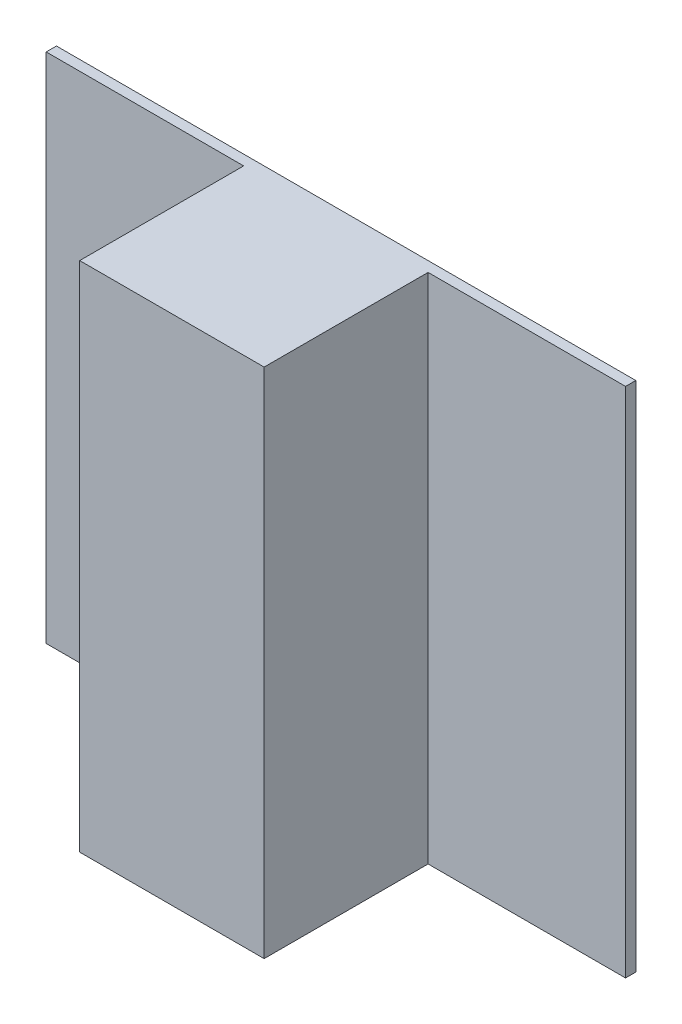
ISO-10303-21;
HEADER;
FILE_DESCRIPTION(('STEP AP214'),'2;1');
FILE_NAME('part.step','',(''),(''),'','','');
FILE_SCHEMA(('AUTOMOTIVE_DESIGN { 1 0 10303 214 1 1 1 1 }'));
ENDSEC;
DATA;
#1=APPLICATION_CONTEXT('core data for automotive mechanical design processes');
#2=APPLICATION_PROTOCOL_DEFINITION('international standard','automotive_design',2000,#1);
#3=PRODUCT_CONTEXT('',#1,'mechanical');
#4=PRODUCT('Part','Part','',(#3));
#5=PRODUCT_RELATED_PRODUCT_CATEGORY('part','',(#4));
#6=PRODUCT_DEFINITION_FORMATION('','',#4);
#7=PRODUCT_DEFINITION_CONTEXT('part definition',#1,'design');
#8=PRODUCT_DEFINITION('design','',#6,#7);
#9=PRODUCT_DEFINITION_SHAPE('','',#8);
#10=(LENGTH_UNIT() NAMED_UNIT(*) SI_UNIT(.MILLI.,.METRE.));
#11=(NAMED_UNIT(*) PLANE_ANGLE_UNIT() SI_UNIT($,.RADIAN.));
#12=(NAMED_UNIT(*) SI_UNIT($,.STERADIAN.) SOLID_ANGLE_UNIT());
#13=UNCERTAINTY_MEASURE_WITH_UNIT(LENGTH_MEASURE(1.E-05),#10,'distance_accuracy_value','');
#14=(GEOMETRIC_REPRESENTATION_CONTEXT(3) GLOBAL_UNCERTAINTY_ASSIGNED_CONTEXT((#13)) GLOBAL_UNIT_ASSIGNED_CONTEXT((#10,
#11,#12)) REPRESENTATION_CONTEXT('',''));
#15=CARTESIAN_POINT('',(0.,0.,0.));
#16=DIRECTION('',(0.,0.,1.));
#17=DIRECTION('',(1.,0.,0.));
#18=AXIS2_PLACEMENT_3D('',#15,#16,#17);
#19=CARTESIAN_POINT('',(0.,0.,5.));
#20=DIRECTION('',(-1.,0.,0.));
#21=DIRECTION('',(0.,0.,1.));
#22=AXIS2_PLACEMENT_3D('',#19,#20,#21);
#23=PLANE('',#22);
#24=DIRECTION('',(0.,0.,-1.));
#25=VECTOR('',#24,1.);
#26=CARTESIAN_POINT('',(0.,0.,5.));
#27=LINE('',#26,#25);
#28=CARTESIAN_POINT('',(0.,0.,5.));
#29=VERTEX_POINT('',#28);
#30=CARTESIAN_POINT('',(0.,0.,-75.));
#31=VERTEX_POINT('',#30);
#32=EDGE_CURVE('E218',#29,#31,#27,.T.);
#33=ORIENTED_EDGE('',*,*,#32,.T.);
#34=DIRECTION('',(0.,-1.,0.));
#35=VECTOR('',#34,1.);
#36=CARTESIAN_POINT('',(0.,250.,-75.));
#37=LINE('',#36,#35);
#38=CARTESIAN_POINT('',(0.,250.,-75.));
#39=VERTEX_POINT('',#38);
#40=EDGE_CURVE('E208',#39,#31,#37,.T.);
#41=ORIENTED_EDGE('',*,*,#40,.F.);
#42=DIRECTION('',(0.,0.,-1.));
#43=VECTOR('',#42,1.);
#44=CARTESIAN_POINT('',(0.,250.,5.));
#45=LINE('',#44,#43);
#46=CARTESIAN_POINT('',(0.,250.,5.));
#47=VERTEX_POINT('',#46);
#48=EDGE_CURVE('E11',#47,#39,#45,.T.);
#49=ORIENTED_EDGE('',*,*,#48,.F.);
#50=DIRECTION('',(0.,1.,0.));
#51=VECTOR('',#50,1.);
#52=CARTESIAN_POINT('',(0.,0.,5.));
#53=LINE('',#52,#51);
#54=EDGE_CURVE('E229',#29,#47,#53,.T.);
#55=ORIENTED_EDGE('',*,*,#54,.F.);
#56=EDGE_LOOP('',(#33,#41,#49,#55));
#57=FACE_BOUND('',#56,.T.);
#58=ADVANCED_FACE('F33',(#57),#23,.F.);
#59=CARTESIAN_POINT('',(0.,250.,5.));
#60=DIRECTION('',(0.,-1.,0.));
#61=DIRECTION('',(0.,0.,-1.));
#62=AXIS2_PLACEMENT_3D('',#59,#60,#61);
#63=PLANE('',#62);
#64=ORIENTED_EDGE('',*,*,#48,.T.);
#65=DIRECTION('',(1.,0.,0.));
#66=VECTOR('',#65,1.);
#67=CARTESIAN_POINT('',(-6.02546336393559,250.,-75.));
#68=LINE('',#67,#66);
#69=CARTESIAN_POINT('',(96.3476528667937,250.,-75.));
#70=VERTEX_POINT('',#69);
#71=EDGE_CURVE('E161',#39,#70,#68,.T.);
#72=ORIENTED_EDGE('',*,*,#71,.T.);
#73=DIRECTION('',(0.,0.,1.));
#74=VECTOR('',#73,1.);
#75=CARTESIAN_POINT('',(96.3476528667937,250.,-80.));
#76=LINE('',#75,#74);
#77=CARTESIAN_POINT('',(96.3476528667937,250.,-80.));
#78=VERTEX_POINT('',#77);
#79=EDGE_CURVE('E179',#78,#70,#76,.T.);
#80=ORIENTED_EDGE('',*,*,#79,.F.);
#81=DIRECTION('',(1.,0.,0.));
#82=VECTOR('',#81,1.);
#83=CARTESIAN_POINT('',(-45.,250.,-80.));
#84=LINE('',#83,#82);
#85=CARTESIAN_POINT('',(-186.347652866794,250.,-80.));
#86=VERTEX_POINT('',#85);
#87=EDGE_CURVE('E162',#86,#78,#84,.T.);
#88=ORIENTED_EDGE('',*,*,#87,.F.);
#89=DIRECTION('',(0.,0.,1.));
#90=VECTOR('',#89,1.);
#91=CARTESIAN_POINT('',(-186.347652866794,250.,-80.));
#92=LINE('',#91,#90);
#93=CARTESIAN_POINT('',(-186.347652866794,250.,-75.));
#94=VERTEX_POINT('',#93);
#95=EDGE_CURVE('E148',#86,#94,#92,.T.);
#96=ORIENTED_EDGE('',*,*,#95,.T.);
#97=DIRECTION('',(-1.,0.,0.));
#98=VECTOR('',#97,1.);
#99=CARTESIAN_POINT('',(-83.9745366360644,250.,-75.));
#100=LINE('',#99,#98);
#101=CARTESIAN_POINT('',(-90.,250.,-75.));
#102=VERTEX_POINT('',#101);
#103=EDGE_CURVE('E145',#102,#94,#100,.T.);
#104=ORIENTED_EDGE('',*,*,#103,.F.);
#105=DIRECTION('',(0.,0.,-1.));
#106=VECTOR('',#105,1.);
#107=CARTESIAN_POINT('',(-90.,250.,5.));
#108=LINE('',#107,#106);
#109=CARTESIAN_POINT('',(-90.,250.,5.));
#110=VERTEX_POINT('',#109);
#111=EDGE_CURVE('E41',#110,#102,#108,.T.);
#112=ORIENTED_EDGE('',*,*,#111,.F.);
#113=DIRECTION('',(-1.,0.,0.));
#114=VECTOR('',#113,1.);
#115=CARTESIAN_POINT('',(0.,250.,5.));
#116=LINE('',#115,#114);
#117=EDGE_CURVE('E228',#47,#110,#116,.T.);
#118=ORIENTED_EDGE('',*,*,#117,.F.);
#119=EDGE_LOOP('',(#64,#72,#80,#88,#96,#104,#112,#118));
#120=FACE_BOUND('',#119,.T.);
#121=ADVANCED_FACE('F241',(#120),#63,.F.);
#122=CARTESIAN_POINT('',(-90.,0.,5.));
#123=DIRECTION('',(1.,0.,0.));
#124=DIRECTION('',(0.,0.,-1.));
#125=AXIS2_PLACEMENT_3D('',#122,#123,#124);
#126=PLANE('',#125);
#127=ORIENTED_EDGE('',*,*,#111,.T.);
#128=DIRECTION('',(0.,1.,0.));
#129=VECTOR('',#128,1.);
#130=CARTESIAN_POINT('',(-90.,250.,-75.));
#131=LINE('',#130,#129);
#132=CARTESIAN_POINT('',(-90.,0.,-75.));
#133=VERTEX_POINT('',#132);
#134=EDGE_CURVE('E211',#133,#102,#131,.T.);
#135=ORIENTED_EDGE('',*,*,#134,.F.);
#136=DIRECTION('',(0.,0.,-1.));
#137=VECTOR('',#136,1.);
#138=CARTESIAN_POINT('',(-90.,0.,5.));
#139=LINE('',#138,#137);
#140=CARTESIAN_POINT('',(-90.,0.,5.));
#141=VERTEX_POINT('',#140);
#142=EDGE_CURVE('E220',#141,#133,#139,.T.);
#143=ORIENTED_EDGE('',*,*,#142,.F.);
#144=DIRECTION('',(0.,-1.,0.));
#145=VECTOR('',#144,1.);
#146=CARTESIAN_POINT('',(-90.,0.,5.));
#147=LINE('',#146,#145);
#148=EDGE_CURVE('E226',#110,#141,#147,.T.);
#149=ORIENTED_EDGE('',*,*,#148,.F.);
#150=EDGE_LOOP('',(#127,#135,#143,#149));
#151=FACE_BOUND('',#150,.T.);
#152=ADVANCED_FACE('F245',(#151),#126,.F.);
#153=CARTESIAN_POINT('',(0.,0.,5.));
#154=DIRECTION('',(0.,1.,0.));
#155=DIRECTION('',(-1.,0.,0.));
#156=AXIS2_PLACEMENT_3D('',#153,#154,#155);
#157=PLANE('',#156);
#158=ORIENTED_EDGE('',*,*,#142,.T.);
#159=DIRECTION('',(1.,0.,0.));
#160=VECTOR('',#159,1.);
#161=CARTESIAN_POINT('',(-121.347652866794,0.,-75.));
#162=LINE('',#161,#160);
#163=CARTESIAN_POINT('',(-186.347652866794,0.,-75.));
#164=VERTEX_POINT('',#163);
#165=EDGE_CURVE('E153',#164,#133,#162,.T.);
#166=ORIENTED_EDGE('',*,*,#165,.F.);
#167=DIRECTION('',(0.,0.,1.));
#168=VECTOR('',#167,1.);
#169=CARTESIAN_POINT('',(-186.347652866794,0.,-80.));
#170=LINE('',#169,#168);
#171=CARTESIAN_POINT('',(-186.347652866794,0.,-80.));
#172=VERTEX_POINT('',#171);
#173=EDGE_CURVE('E159',#172,#164,#170,.T.);
#174=ORIENTED_EDGE('',*,*,#173,.F.);
#175=DIRECTION('',(-1.,0.,0.));
#176=VECTOR('',#175,1.);
#177=CARTESIAN_POINT('',(31.3476528667937,0.,-80.));
#178=LINE('',#177,#176);
#179=CARTESIAN_POINT('',(96.3476528667937,0.,-80.));
#180=VERTEX_POINT('',#179);
#181=EDGE_CURVE('E167',#180,#172,#178,.T.);
#182=ORIENTED_EDGE('',*,*,#181,.F.);
#183=DIRECTION('',(0.,0.,1.));
#184=VECTOR('',#183,1.);
#185=CARTESIAN_POINT('',(96.3476528667937,0.,-80.));
#186=LINE('',#185,#184);
#187=CARTESIAN_POINT('',(96.3476528667937,0.,-75.));
#188=VERTEX_POINT('',#187);
#189=EDGE_CURVE('E140',#180,#188,#186,.T.);
#190=ORIENTED_EDGE('',*,*,#189,.T.);
#191=DIRECTION('',(-1.,0.,0.));
#192=VECTOR('',#191,1.);
#193=CARTESIAN_POINT('',(-45.,0.,-75.));
#194=LINE('',#193,#192);
#195=EDGE_CURVE('E165',#188,#31,#194,.T.);
#196=ORIENTED_EDGE('',*,*,#195,.T.);
#197=ORIENTED_EDGE('',*,*,#32,.F.);
#198=DIRECTION('',(1.,0.,0.));
#199=VECTOR('',#198,1.);
#200=CARTESIAN_POINT('',(0.,0.,5.));
#201=LINE('',#200,#199);
#202=EDGE_CURVE('E56',#141,#29,#201,.T.);
#203=ORIENTED_EDGE('',*,*,#202,.F.);
#204=EDGE_LOOP('',(#158,#166,#174,#182,#190,#196,#197,#203));
#205=FACE_BOUND('',#204,.T.);
#206=ADVANCED_FACE('F254',(#205),#157,.F.);
#207=CARTESIAN_POINT('',(0.,0.,5.));
#208=DIRECTION('',(0.,0.,1.));
#209=DIRECTION('',(1.,0.,0.));
#210=AXIS2_PLACEMENT_3D('',#207,#208,#209);
#211=PLANE('',#210);
#212=ORIENTED_EDGE('',*,*,#54,.T.);
#213=ORIENTED_EDGE('',*,*,#117,.T.);
#214=ORIENTED_EDGE('',*,*,#148,.T.);
#215=ORIENTED_EDGE('',*,*,#202,.T.);
#216=EDGE_LOOP('',(#212,#213,#214,#215));
#217=FACE_BOUND('',#216,.T.);
#218=ADVANCED_FACE('F246',(#217),#211,.T.);
#219=CARTESIAN_POINT('',(-5.,245.,-75.));
#220=DIRECTION('',(0.,-1.,0.));
#221=DIRECTION('',(0.,0.,-1.));
#222=AXIS2_PLACEMENT_3D('',#219,#220,#221);
#223=PLANE('',#222);
#224=DIRECTION('',(1.,0.,0.));
#225=VECTOR('',#224,1.);
#226=CARTESIAN_POINT('',(-5.,245.,0.));
#227=LINE('',#226,#225);
#228=CARTESIAN_POINT('',(-85.,245.,0.));
#229=VERTEX_POINT('',#228);
#230=CARTESIAN_POINT('',(-5.,245.,0.));
#231=VERTEX_POINT('',#230);
#232=EDGE_CURVE('E127',#229,#231,#227,.T.);
#233=ORIENTED_EDGE('',*,*,#232,.F.);
#234=DIRECTION('',(0.,0.,1.));
#235=VECTOR('',#234,1.);
#236=CARTESIAN_POINT('',(-85.,245.,-75.));
#237=LINE('',#236,#235);
#238=CARTESIAN_POINT('',(-85.,245.,-80.));
#239=VERTEX_POINT('',#238);
#240=EDGE_CURVE('E48',#239,#229,#237,.T.);
#241=ORIENTED_EDGE('',*,*,#240,.F.);
#242=DIRECTION('',(-1.,0.,0.));
#243=VECTOR('',#242,1.);
#244=CARTESIAN_POINT('',(-45.,245.,-80.));
#245=LINE('',#244,#243);
#246=CARTESIAN_POINT('',(-5.,245.,-80.));
#247=VERTEX_POINT('',#246);
#248=EDGE_CURVE('E125',#247,#239,#245,.T.);
#249=ORIENTED_EDGE('',*,*,#248,.F.);
#250=DIRECTION('',(0.,0.,1.));
#251=VECTOR('',#250,1.);
#252=CARTESIAN_POINT('',(-5.,245.,-75.));
#253=LINE('',#252,#251);
#254=EDGE_CURVE('E206',#247,#231,#253,.T.);
#255=ORIENTED_EDGE('',*,*,#254,.T.);
#256=EDGE_LOOP('',(#233,#241,#249,#255));
#257=FACE_BOUND('',#256,.T.);
#258=ADVANCED_FACE('F123',(#257),#223,.T.);
#259=CARTESIAN_POINT('',(-5.,245.,-75.));
#260=DIRECTION('',(-1.,0.,0.));
#261=DIRECTION('',(0.,0.,1.));
#262=AXIS2_PLACEMENT_3D('',#259,#260,#261);
#263=PLANE('',#262);
#264=DIRECTION('',(0.,-1.,0.));
#265=VECTOR('',#264,1.);
#266=CARTESIAN_POINT('',(-5.,245.,0.));
#267=LINE('',#266,#265);
#268=CARTESIAN_POINT('',(-5.,4.99999999999999,0.));
#269=VERTEX_POINT('',#268);
#270=EDGE_CURVE('E195',#231,#269,#267,.T.);
#271=ORIENTED_EDGE('',*,*,#270,.F.);
#272=ORIENTED_EDGE('',*,*,#254,.F.);
#273=DIRECTION('',(0.,1.,0.));
#274=VECTOR('',#273,1.);
#275=CARTESIAN_POINT('',(-5.,245.,-80.));
#276=LINE('',#275,#274);
#277=CARTESIAN_POINT('',(-5.,4.99999999999999,-80.));
#278=VERTEX_POINT('',#277);
#279=EDGE_CURVE('E139',#278,#247,#276,.T.);
#280=ORIENTED_EDGE('',*,*,#279,.F.);
#281=DIRECTION('',(0.,0.,1.));
#282=VECTOR('',#281,1.);
#283=CARTESIAN_POINT('',(-5.,4.99999999999999,-75.));
#284=LINE('',#283,#282);
#285=EDGE_CURVE('E204',#278,#269,#284,.T.);
#286=ORIENTED_EDGE('',*,*,#285,.T.);
#287=EDGE_LOOP('',(#271,#272,#280,#286));
#288=FACE_BOUND('',#287,.T.);
#289=ADVANCED_FACE('F285',(#288),#263,.T.);
#290=CARTESIAN_POINT('',(-5.,4.99999999999999,-75.));
#291=DIRECTION('',(0.,1.,0.));
#292=DIRECTION('',(-1.,0.,0.));
#293=AXIS2_PLACEMENT_3D('',#290,#291,#292);
#294=PLANE('',#293);
#295=DIRECTION('',(1.,0.,0.));
#296=VECTOR('',#295,1.);
#297=CARTESIAN_POINT('',(-45.,4.99999999999998,-80.));
#298=LINE('',#297,#296);
#299=CARTESIAN_POINT('',(-85.,4.99999999999999,-80.));
#300=VERTEX_POINT('',#299);
#301=EDGE_CURVE('E169',#300,#278,#298,.T.);
#302=ORIENTED_EDGE('',*,*,#301,.F.);
#303=DIRECTION('',(0.,0.,1.));
#304=VECTOR('',#303,1.);
#305=CARTESIAN_POINT('',(-85.,4.99999999999998,-75.));
#306=LINE('',#305,#304);
#307=CARTESIAN_POINT('',(-85.,4.99999999999998,0.));
#308=VERTEX_POINT('',#307);
#309=EDGE_CURVE('E129',#300,#308,#306,.T.);
#310=ORIENTED_EDGE('',*,*,#309,.T.);
#311=DIRECTION('',(-1.,0.,0.));
#312=VECTOR('',#311,1.);
#313=CARTESIAN_POINT('',(-5.,4.99999999999999,0.));
#314=LINE('',#313,#312);
#315=EDGE_CURVE('E198',#269,#308,#314,.T.);
#316=ORIENTED_EDGE('',*,*,#315,.F.);
#317=ORIENTED_EDGE('',*,*,#285,.F.);
#318=EDGE_LOOP('',(#302,#310,#316,#317));
#319=FACE_BOUND('',#318,.T.);
#320=ADVANCED_FACE('F288',(#319),#294,.T.);
#321=CARTESIAN_POINT('',(-85.,245.,-75.));
#322=DIRECTION('',(1.,0.,0.));
#323=DIRECTION('',(0.,0.,-1.));
#324=AXIS2_PLACEMENT_3D('',#321,#322,#323);
#325=PLANE('',#324);
#326=DIRECTION('',(0.,1.,0.));
#327=VECTOR('',#326,1.);
#328=CARTESIAN_POINT('',(-85.,245.,0.));
#329=LINE('',#328,#327);
#330=EDGE_CURVE('E130',#308,#229,#329,.T.);
#331=ORIENTED_EDGE('',*,*,#330,.F.);
#332=ORIENTED_EDGE('',*,*,#309,.F.);
#333=DIRECTION('',(0.,1.,0.));
#334=VECTOR('',#333,1.);
#335=CARTESIAN_POINT('',(-85.,245.,-80.));
#336=LINE('',#335,#334);
#337=EDGE_CURVE('E137',#300,#239,#336,.T.);
#338=ORIENTED_EDGE('',*,*,#337,.T.);
#339=ORIENTED_EDGE('',*,*,#240,.T.);
#340=EDGE_LOOP('',(#331,#332,#338,#339));
#341=FACE_BOUND('',#340,.T.);
#342=ADVANCED_FACE('F142',(#341),#325,.T.);
#343=CARTESIAN_POINT('',(0.,0.,0.));
#344=DIRECTION('',(0.,0.,1.));
#345=DIRECTION('',(1.,0.,0.));
#346=AXIS2_PLACEMENT_3D('',#343,#344,#345);
#347=PLANE('',#346);
#348=ORIENTED_EDGE('',*,*,#330,.T.);
#349=ORIENTED_EDGE('',*,*,#232,.T.);
#350=ORIENTED_EDGE('',*,*,#270,.T.);
#351=ORIENTED_EDGE('',*,*,#315,.T.);
#352=EDGE_LOOP('',(#348,#349,#350,#351));
#353=FACE_BOUND('',#352,.T.);
#354=ADVANCED_FACE('F278',(#353),#347,.F.);
#355=CARTESIAN_POINT('',(0.,0.,-75.));
#356=DIRECTION('',(0.,0.,-1.));
#357=DIRECTION('',(-1.,0.,0.));
#358=AXIS2_PLACEMENT_3D('',#355,#356,#357);
#359=PLANE('',#358);
#360=ORIENTED_EDGE('',*,*,#71,.F.);
#361=ORIENTED_EDGE('',*,*,#40,.T.);
#362=ORIENTED_EDGE('',*,*,#195,.F.);
#363=DIRECTION('',(0.,-1.,0.));
#364=VECTOR('',#363,1.);
#365=CARTESIAN_POINT('',(96.3476528667937,250.,-75.));
#366=LINE('',#365,#364);
#367=EDGE_CURVE('E174',#70,#188,#366,.T.);
#368=ORIENTED_EDGE('',*,*,#367,.F.);
#369=EDGE_LOOP('',(#360,#361,#362,#368));
#370=FACE_BOUND('',#369,.T.);
#371=ADVANCED_FACE('F251',(#370),#359,.F.);
#372=CARTESIAN_POINT('',(96.3476528667937,250.,-80.));
#373=DIRECTION('',(-1.,0.,0.));
#374=DIRECTION('',(0.,0.,1.));
#375=AXIS2_PLACEMENT_3D('',#372,#373,#374);
#376=PLANE('',#375);
#377=ORIENTED_EDGE('',*,*,#367,.T.);
#378=ORIENTED_EDGE('',*,*,#189,.F.);
#379=DIRECTION('',(0.,-1.,0.));
#380=VECTOR('',#379,1.);
#381=CARTESIAN_POINT('',(96.3476528667937,250.,-80.));
#382=LINE('',#381,#380);
#383=EDGE_CURVE('E164',#78,#180,#382,.T.);
#384=ORIENTED_EDGE('',*,*,#383,.F.);
#385=ORIENTED_EDGE('',*,*,#79,.T.);
#386=EDGE_LOOP('',(#377,#378,#384,#385));
#387=FACE_BOUND('',#386,.T.);
#388=ADVANCED_FACE('F252',(#387),#376,.F.);
#389=CARTESIAN_POINT('',(0.,0.,-80.));
#390=DIRECTION('',(0.,0.,-1.));
#391=DIRECTION('',(-1.,0.,0.));
#392=AXIS2_PLACEMENT_3D('',#389,#390,#391);
#393=PLANE('',#392);
#394=DIRECTION('',(0.,-1.,0.));
#395=VECTOR('',#394,1.);
#396=CARTESIAN_POINT('',(-186.347652866794,250.,-80.));
#397=LINE('',#396,#395);
#398=EDGE_CURVE('E144',#86,#172,#397,.T.);
#399=ORIENTED_EDGE('',*,*,#398,.F.);
#400=ORIENTED_EDGE('',*,*,#87,.T.);
#401=ORIENTED_EDGE('',*,*,#383,.T.);
#402=ORIENTED_EDGE('',*,*,#181,.T.);
#403=EDGE_LOOP('',(#399,#400,#401,#402));
#404=FACE_BOUND('',#403,.T.);
#405=ORIENTED_EDGE('',*,*,#248,.T.);
#406=ORIENTED_EDGE('',*,*,#337,.F.);
#407=ORIENTED_EDGE('',*,*,#301,.T.);
#408=ORIENTED_EDGE('',*,*,#279,.T.);
#409=EDGE_LOOP('',(#405,#406,#407,#408));
#410=FACE_BOUND('',#409,.T.);
#411=ADVANCED_FACE('F135',(#404,#410),#393,.T.);
#412=CARTESIAN_POINT('',(-90.,0.,-75.));
#413=DIRECTION('',(0.,0.,-1.));
#414=DIRECTION('',(1.,0.,0.));
#415=AXIS2_PLACEMENT_3D('',#412,#413,#414);
#416=PLANE('',#415);
#417=ORIENTED_EDGE('',*,*,#165,.T.);
#418=ORIENTED_EDGE('',*,*,#134,.T.);
#419=ORIENTED_EDGE('',*,*,#103,.T.);
#420=DIRECTION('',(0.,-1.,0.));
#421=VECTOR('',#420,1.);
#422=CARTESIAN_POINT('',(-186.347652866794,250.,-75.));
#423=LINE('',#422,#421);
#424=EDGE_CURVE('E150',#94,#164,#423,.T.);
#425=ORIENTED_EDGE('',*,*,#424,.T.);
#426=EDGE_LOOP('',(#417,#418,#419,#425));
#427=FACE_BOUND('',#426,.T.);
#428=ADVANCED_FACE('F235',(#427),#416,.F.);
#429=CARTESIAN_POINT('',(-186.347652866794,250.,-80.));
#430=DIRECTION('',(-1.,0.,0.));
#431=DIRECTION('',(0.,0.,1.));
#432=AXIS2_PLACEMENT_3D('',#429,#430,#431);
#433=PLANE('',#432);
#434=ORIENTED_EDGE('',*,*,#424,.F.);
#435=ORIENTED_EDGE('',*,*,#95,.F.);
#436=ORIENTED_EDGE('',*,*,#398,.T.);
#437=ORIENTED_EDGE('',*,*,#173,.T.);
#438=EDGE_LOOP('',(#434,#435,#436,#437));
#439=FACE_BOUND('',#438,.T.);
#440=ADVANCED_FACE('F258',(#439),#433,.T.);
#441=CLOSED_SHELL('',(#58,#121,#152,#206,#218,#258,#289,#320,#342,#354,#371,#388,#411,#428,#440));
#442=MANIFOLD_SOLID_BREP('B2',#441);
#443=ADVANCED_BREP_SHAPE_REPRESENTATION('',(#18,#442),#14);
#444=SHAPE_DEFINITION_REPRESENTATION(#9,#443);
ENDSEC;
END-ISO-10303-21;
